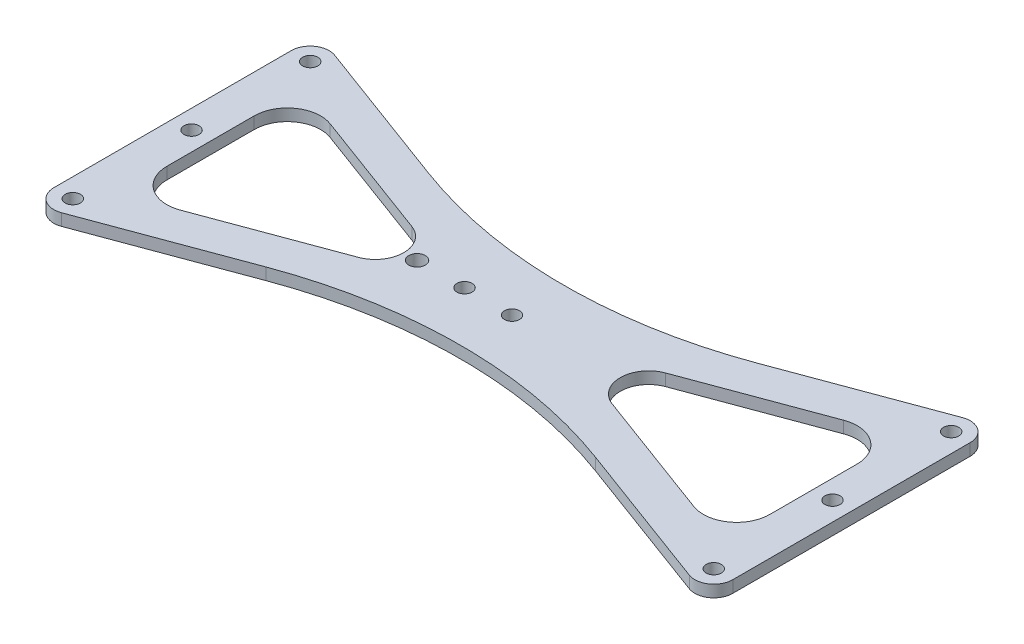
ISO-10303-21;
HEADER;
FILE_DESCRIPTION(('STEP AP214'),'2;1');
FILE_NAME('part.step','',(''),(''),'','','');
FILE_SCHEMA(('AUTOMOTIVE_DESIGN { 1 0 10303 214 1 1 1 1 }'));
ENDSEC;
DATA;
#1=APPLICATION_CONTEXT('core data for automotive mechanical design processes');
#2=APPLICATION_PROTOCOL_DEFINITION('international standard','automotive_design',2000,#1);
#3=PRODUCT_CONTEXT('',#1,'mechanical');
#4=PRODUCT('Part','Part','',(#3));
#5=PRODUCT_RELATED_PRODUCT_CATEGORY('part','',(#4));
#6=PRODUCT_DEFINITION_FORMATION('','',#4);
#7=PRODUCT_DEFINITION_CONTEXT('part definition',#1,'design');
#8=PRODUCT_DEFINITION('design','',#6,#7);
#9=PRODUCT_DEFINITION_SHAPE('','',#8);
#10=(LENGTH_UNIT() NAMED_UNIT(*) SI_UNIT(.MILLI.,.METRE.));
#11=(NAMED_UNIT(*) PLANE_ANGLE_UNIT() SI_UNIT($,.RADIAN.));
#12=(NAMED_UNIT(*) SI_UNIT($,.STERADIAN.) SOLID_ANGLE_UNIT());
#13=UNCERTAINTY_MEASURE_WITH_UNIT(LENGTH_MEASURE(1.E-05),#10,'distance_accuracy_value','');
#14=(GEOMETRIC_REPRESENTATION_CONTEXT(3) GLOBAL_UNCERTAINTY_ASSIGNED_CONTEXT((#13)) GLOBAL_UNIT_ASSIGNED_CONTEXT((#10,
#11,#12)) REPRESENTATION_CONTEXT('',''));
#15=CARTESIAN_POINT('',(0.,0.,0.));
#16=DIRECTION('',(0.,0.,1.));
#17=DIRECTION('',(1.,0.,0.));
#18=AXIS2_PLACEMENT_3D('',#15,#16,#17);
#19=CARTESIAN_POINT('',(80.6450000000001,3.175,0.));
#20=DIRECTION('',(1.,0.,0.));
#21=DIRECTION('',(0.,0.,-1.));
#22=AXIS2_PLACEMENT_3D('',#19,#20,#21);
#23=PLANE('',#22);
#24=DIRECTION('',(0.,0.,1.));
#25=VECTOR('',#24,1.);
#26=CARTESIAN_POINT('',(80.6450000000001,0.,0.));
#27=LINE('',#26,#25);
#28=CARTESIAN_POINT('',(80.6450000000001,0.,-11.6785455345952));
#29=VERTEX_POINT('',#28);
#30=CARTESIAN_POINT('',(80.6450000000001,0.,11.6785455345952));
#31=VERTEX_POINT('',#30);
#32=EDGE_CURVE('E316',#29,#31,#27,.T.);
#33=ORIENTED_EDGE('',*,*,#32,.T.);
#34=DIRECTION('',(0.,-1.,0.));
#35=VECTOR('',#34,1.);
#36=CARTESIAN_POINT('',(80.6450000000001,3.175,11.6785455345952));
#37=LINE('',#36,#35);
#38=CARTESIAN_POINT('',(80.6450000000001,3.175,11.6785455345952));
#39=VERTEX_POINT('',#38);
#40=EDGE_CURVE('E365',#31,#39,#37,.F.);
#41=ORIENTED_EDGE('',*,*,#40,.T.);
#42=DIRECTION('',(0.,0.,1.));
#43=VECTOR('',#42,1.);
#44=CARTESIAN_POINT('',(80.6450000000001,3.175,0.));
#45=LINE('',#44,#43);
#46=CARTESIAN_POINT('',(80.6450000000001,3.175,-11.6785455345952));
#47=VERTEX_POINT('',#46);
#48=EDGE_CURVE('E258',#47,#39,#45,.T.);
#49=ORIENTED_EDGE('',*,*,#48,.F.);
#50=DIRECTION('',(0.,-1.,0.));
#51=VECTOR('',#50,1.);
#52=CARTESIAN_POINT('',(80.6450000000001,3.175,-11.6785455345952));
#53=LINE('',#52,#51);
#54=EDGE_CURVE('E360',#47,#29,#53,.T.);
#55=ORIENTED_EDGE('',*,*,#54,.T.);
#56=EDGE_LOOP('',(#33,#41,#49,#55));
#57=FACE_BOUND('',#56,.T.);
#58=ADVANCED_FACE('F43',(#57),#23,.F.);
#59=CARTESIAN_POINT('',(1.76435692758385,3.175,-4.76376370447641));
#60=DIRECTION('',(0.347314355823594,0.,-0.937748760723704));
#61=DIRECTION('',(-0.937748760723704,0.,-0.347314355823594));
#62=AXIS2_PLACEMENT_3D('',#59,#60,#61);
#63=PLANE('',#62);
#64=DIRECTION('',(0.937748760723704,0.,0.347314355823594));
#65=VECTOR('',#64,1.);
#66=CARTESIAN_POINT('',(1.76435692758385,0.,-4.76376370447641));
#67=LINE('',#66,#65);
#68=CARTESIAN_POINT('',(33.9197619327997,0.,7.14564555671461));
#69=VERTEX_POINT('',#68);
#70=CARTESIAN_POINT('',(68.6673753767283,0.,20.0151320174289));
#71=VERTEX_POINT('',#70);
#72=EDGE_CURVE('E325',#69,#71,#67,.T.);
#73=ORIENTED_EDGE('',*,*,#72,.F.);
#74=DIRECTION('',(0.,-1.,0.));
#75=VECTOR('',#74,1.);
#76=CARTESIAN_POINT('',(33.9197619327996,3.175,7.14564555671461));
#77=LINE('',#76,#75);
#78=CARTESIAN_POINT('',(33.9197619327997,3.175,7.14564555671461));
#79=VERTEX_POINT('',#78);
#80=EDGE_CURVE('E399',#69,#79,#77,.F.);
#81=ORIENTED_EDGE('',*,*,#80,.T.);
#82=DIRECTION('',(0.937748760723704,0.,0.347314355823594));
#83=VECTOR('',#82,1.);
#84=CARTESIAN_POINT('',(1.76435692758385,3.175,-4.76376370447641));
#85=LINE('',#84,#83);
#86=CARTESIAN_POINT('',(68.6673753767283,3.175,20.0151320174289));
#87=VERTEX_POINT('',#86);
#88=EDGE_CURVE('E265',#79,#87,#85,.T.);
#89=ORIENTED_EDGE('',*,*,#88,.T.);
#90=DIRECTION('',(0.,-1.,0.));
#91=VECTOR('',#90,1.);
#92=CARTESIAN_POINT('',(68.6673753767283,3.175,20.0151320174289));
#93=LINE('',#92,#91);
#94=EDGE_CURVE('E227',#87,#71,#93,.T.);
#95=ORIENTED_EDGE('',*,*,#94,.T.);
#96=EDGE_LOOP('',(#73,#81,#89,#95));
#97=FACE_BOUND('',#96,.T.);
#98=ADVANCED_FACE('F473',(#97),#63,.T.);
#99=CARTESIAN_POINT('',(-1.76435692758386,3.175,4.76376370447642));
#100=DIRECTION('',(0.347314355823594,0.,-0.937748760723704));
#101=DIRECTION('',(-0.937748760723704,0.,-0.347314355823594));
#102=AXIS2_PLACEMENT_3D('',#99,#100,#101);
#103=PLANE('',#102);
#104=DIRECTION('',(0.937748760723704,0.,0.347314355823594));
#105=VECTOR('',#104,1.);
#106=CARTESIAN_POINT('',(-1.76435692758386,0.,4.76376370447642));
#107=LINE('',#106,#105);
#108=CARTESIAN_POINT('',(-68.6673753767283,0.,-20.0151320174289));
#109=VERTEX_POINT('',#108);
#110=CARTESIAN_POINT('',(-33.9197619327997,0.,-7.14564555671461));
#111=VERTEX_POINT('',#110);
#112=EDGE_CURVE('E311',#109,#111,#107,.T.);
#113=ORIENTED_EDGE('',*,*,#112,.T.);
#114=DIRECTION('',(0.,-1.,0.));
#115=VECTOR('',#114,1.);
#116=CARTESIAN_POINT('',(-33.9197619327997,3.175,-7.14564555671461));
#117=LINE('',#116,#115);
#118=CARTESIAN_POINT('',(-33.9197619327997,3.175,-7.14564555671461));
#119=VERTEX_POINT('',#118);
#120=EDGE_CURVE('E401',#111,#119,#117,.F.);
#121=ORIENTED_EDGE('',*,*,#120,.T.);
#122=DIRECTION('',(0.937748760723704,0.,0.347314355823594));
#123=VECTOR('',#122,1.);
#124=CARTESIAN_POINT('',(-1.76435692758386,3.175,4.76376370447642));
#125=LINE('',#124,#123);
#126=CARTESIAN_POINT('',(-68.6673753767283,3.175,-20.0151320174289));
#127=VERTEX_POINT('',#126);
#128=EDGE_CURVE('E255',#127,#119,#125,.T.);
#129=ORIENTED_EDGE('',*,*,#128,.F.);
#130=DIRECTION('',(0.,-1.,0.));
#131=VECTOR('',#130,1.);
#132=CARTESIAN_POINT('',(-68.6673753767283,3.175,-20.0151320174289));
#133=LINE('',#132,#131);
#134=EDGE_CURVE('E372',#127,#109,#133,.T.);
#135=ORIENTED_EDGE('',*,*,#134,.T.);
#136=EDGE_LOOP('',(#113,#121,#129,#135));
#137=FACE_BOUND('',#136,.T.);
#138=ADVANCED_FACE('F484',(#137),#103,.F.);
#139=CARTESIAN_POINT('',(-1.76435692758386,3.175,-4.76376370447642));
#140=DIRECTION('',(0.347314355823594,0.,0.937748760723703));
#141=DIRECTION('',(0.937748760723704,0.,-0.347314355823594));
#142=AXIS2_PLACEMENT_3D('',#139,#140,#141);
#143=PLANE('',#142);
#144=DIRECTION('',(-0.937748760723704,0.,0.347314355823594));
#145=VECTOR('',#144,1.);
#146=CARTESIAN_POINT('',(-1.76435692758386,3.175,-4.76376370447642));
#147=LINE('',#146,#145);
#148=CARTESIAN_POINT('',(-33.9197619327997,3.175,7.14564555671464));
#149=VERTEX_POINT('',#148);
#150=CARTESIAN_POINT('',(-68.6673753767283,3.175,20.0151320174289));
#151=VERTEX_POINT('',#150);
#152=EDGE_CURVE('E253',#149,#151,#147,.T.);
#153=ORIENTED_EDGE('',*,*,#152,.F.);
#154=DIRECTION('',(0.,-1.,0.));
#155=VECTOR('',#154,1.);
#156=CARTESIAN_POINT('',(-33.9197619327997,0.,7.14564555671464));
#157=LINE('',#156,#155);
#158=CARTESIAN_POINT('',(-33.9197619327997,0.,7.14564555671464));
#159=VERTEX_POINT('',#158);
#160=EDGE_CURVE('E400',#149,#159,#157,.T.);
#161=ORIENTED_EDGE('',*,*,#160,.T.);
#162=DIRECTION('',(-0.937748760723704,0.,0.347314355823594));
#163=VECTOR('',#162,1.);
#164=CARTESIAN_POINT('',(-1.76435692758386,0.,-4.76376370447642));
#165=LINE('',#164,#163);
#166=CARTESIAN_POINT('',(-68.6673753767283,0.,20.0151320174289));
#167=VERTEX_POINT('',#166);
#168=EDGE_CURVE('E313',#159,#167,#165,.T.);
#169=ORIENTED_EDGE('',*,*,#168,.T.);
#170=DIRECTION('',(0.,-1.,0.));
#171=VECTOR('',#170,1.);
#172=CARTESIAN_POINT('',(-68.6673753767283,3.175,20.0151320174289));
#173=LINE('',#172,#171);
#174=EDGE_CURVE('E371',#167,#151,#173,.F.);
#175=ORIENTED_EDGE('',*,*,#174,.T.);
#176=EDGE_LOOP('',(#153,#161,#169,#175));
#177=FACE_BOUND('',#176,.T.);
#178=ADVANCED_FACE('F495',(#177),#143,.F.);
#179=CARTESIAN_POINT('',(85.725,3.175,31.75));
#180=DIRECTION('',(0.,-1.,0.));
#181=DIRECTION('',(0.,0.,-1.));
#182=AXIS2_PLACEMENT_3D('',#179,#180,#181);
#183=CYLINDRICAL_SURFACE('',#182,5.08);
#184=CARTESIAN_POINT('',(85.725,0.,31.75));
#185=DIRECTION('',(0.,1.,0.));
#186=DIRECTION('',(0.,0.,1.));
#187=AXIS2_PLACEMENT_3D('',#184,#185,#186);
#188=CIRCLE('',#187,5.08);
#189=CARTESIAN_POINT('',(83.9606430724161,0.,36.5137637044764));
#190=VERTEX_POINT('',#189);
#191=CARTESIAN_POINT('',(90.805,0.,31.75));
#192=VERTEX_POINT('',#191);
#193=EDGE_CURVE('E224',#190,#192,#188,.T.);
#194=ORIENTED_EDGE('',*,*,#193,.T.);
#195=DIRECTION('',(0.,-1.,0.));
#196=VECTOR('',#195,1.);
#197=CARTESIAN_POINT('',(90.805,3.175,31.75));
#198=LINE('',#197,#196);
#199=CARTESIAN_POINT('',(90.805,3.175,31.75));
#200=VERTEX_POINT('',#199);
#201=EDGE_CURVE('E218',#200,#192,#198,.T.);
#202=ORIENTED_EDGE('',*,*,#201,.F.);
#203=CARTESIAN_POINT('',(85.725,3.175,31.75));
#204=DIRECTION('',(0.,1.,0.));
#205=DIRECTION('',(0.,0.,1.));
#206=AXIS2_PLACEMENT_3D('',#203,#204,#205);
#207=CIRCLE('',#206,5.08);
#208=CARTESIAN_POINT('',(83.9606430724161,3.175,36.5137637044764));
#209=VERTEX_POINT('',#208);
#210=EDGE_CURVE('E203',#209,#200,#207,.T.);
#211=ORIENTED_EDGE('',*,*,#210,.F.);
#212=DIRECTION('',(0.,-1.,0.));
#213=VECTOR('',#212,1.);
#214=CARTESIAN_POINT('',(83.9606430724161,3.175,36.5137637044764));
#215=LINE('',#214,#213);
#216=EDGE_CURVE('E286',#209,#190,#215,.T.);
#217=ORIENTED_EDGE('',*,*,#216,.T.);
#218=EDGE_LOOP('',(#194,#202,#211,#217));
#219=FACE_BOUND('',#218,.T.);
#220=ADVANCED_FACE('F221',(#219),#183,.T.);
#221=CARTESIAN_POINT('',(90.805,3.175,0.));
#222=DIRECTION('',(1.,0.,0.));
#223=DIRECTION('',(0.,0.,-1.));
#224=AXIS2_PLACEMENT_3D('',#221,#222,#223);
#225=PLANE('',#224);
#226=DIRECTION('',(0.,0.,1.));
#227=VECTOR('',#226,1.);
#228=CARTESIAN_POINT('',(90.805,0.,0.));
#229=LINE('',#228,#227);
#230=CARTESIAN_POINT('',(90.805,0.,-31.7500000000001));
#231=VERTEX_POINT('',#230);
#232=EDGE_CURVE('E289',#231,#192,#229,.T.);
#233=ORIENTED_EDGE('',*,*,#232,.F.);
#234=DIRECTION('',(0.,-1.,0.));
#235=VECTOR('',#234,1.);
#236=CARTESIAN_POINT('',(90.805,3.175,-31.7500000000001));
#237=LINE('',#236,#235);
#238=CARTESIAN_POINT('',(90.805,3.175,-31.7500000000001));
#239=VERTEX_POINT('',#238);
#240=EDGE_CURVE('E226',#239,#231,#237,.T.);
#241=ORIENTED_EDGE('',*,*,#240,.F.);
#242=DIRECTION('',(0.,0.,1.));
#243=VECTOR('',#242,1.);
#244=CARTESIAN_POINT('',(90.805,3.175,0.));
#245=LINE('',#244,#243);
#246=EDGE_CURVE('E208',#239,#200,#245,.T.);
#247=ORIENTED_EDGE('',*,*,#246,.T.);
#248=ORIENTED_EDGE('',*,*,#201,.T.);
#249=EDGE_LOOP('',(#233,#241,#247,#248));
#250=FACE_BOUND('',#249,.T.);
#251=ADVANCED_FACE('F229',(#250),#225,.T.);
#252=CARTESIAN_POINT('',(85.725,3.175,-31.7500000000001));
#253=DIRECTION('',(0.,-1.,0.));
#254=DIRECTION('',(0.,0.,-1.));
#255=AXIS2_PLACEMENT_3D('',#252,#253,#254);
#256=CYLINDRICAL_SURFACE('',#255,5.08);
#257=CARTESIAN_POINT('',(85.725,0.,-31.7500000000001));
#258=DIRECTION('',(0.,1.,0.));
#259=DIRECTION('',(0.,0.,1.));
#260=AXIS2_PLACEMENT_3D('',#257,#258,#259);
#261=CIRCLE('',#260,5.08);
#262=CARTESIAN_POINT('',(83.9606430724162,0.,-36.5137637044765));
#263=VERTEX_POINT('',#262);
#264=EDGE_CURVE('E293',#263,#231,#261,.F.);
#265=ORIENTED_EDGE('',*,*,#264,.F.);
#266=DIRECTION('',(0.,-1.,0.));
#267=VECTOR('',#266,1.);
#268=CARTESIAN_POINT('',(83.9606430724162,3.175,-36.5137637044765));
#269=LINE('',#268,#267);
#270=CARTESIAN_POINT('',(83.9606430724162,3.175,-36.5137637044765));
#271=VERTEX_POINT('',#270);
#272=EDGE_CURVE('E353',#271,#263,#269,.T.);
#273=ORIENTED_EDGE('',*,*,#272,.F.);
#274=CARTESIAN_POINT('',(85.725,3.175,-31.7500000000001));
#275=DIRECTION('',(0.,1.,0.));
#276=DIRECTION('',(0.,0.,1.));
#277=AXIS2_PLACEMENT_3D('',#274,#275,#276);
#278=CIRCLE('',#277,5.08);
#279=EDGE_CURVE('E233',#271,#239,#278,.F.);
#280=ORIENTED_EDGE('',*,*,#279,.T.);
#281=ORIENTED_EDGE('',*,*,#240,.T.);
#282=EDGE_LOOP('',(#265,#273,#280,#281));
#283=FACE_BOUND('',#282,.T.);
#284=ADVANCED_FACE('F463',(#283),#256,.T.);
#285=CARTESIAN_POINT('',(-1.76435692758386,3.175,-4.76376370447642));
#286=DIRECTION('',(0.347314355823594,0.,0.937748760723703));
#287=DIRECTION('',(0.937748760723704,0.,-0.347314355823594));
#288=AXIS2_PLACEMENT_3D('',#285,#286,#287);
#289=PLANE('',#288);
#290=DIRECTION('',(-0.937748760723704,0.,0.347314355823594));
#291=VECTOR('',#290,1.);
#292=CARTESIAN_POINT('',(-1.76435692758386,0.,-4.76376370447642));
#293=LINE('',#292,#291);
#294=CARTESIAN_POINT('',(44.1089231895965,0.,-21.7538674515802));
#295=VERTEX_POINT('',#294);
#296=EDGE_CURVE('E295',#263,#295,#293,.T.);
#297=ORIENTED_EDGE('',*,*,#296,.T.);
#298=DIRECTION('',(0.,-1.,0.));
#299=VECTOR('',#298,1.);
#300=CARTESIAN_POINT('',(44.1089231895964,3.175,-21.7538674515802));
#301=LINE('',#300,#299);
#302=CARTESIAN_POINT('',(44.1089231895965,3.175,-21.7538674515802));
#303=VERTEX_POINT('',#302);
#304=EDGE_CURVE('E59',#295,#303,#301,.F.);
#305=ORIENTED_EDGE('',*,*,#304,.T.);
#306=DIRECTION('',(-0.937748760723704,0.,0.347314355823594));
#307=VECTOR('',#306,1.);
#308=CARTESIAN_POINT('',(-1.76435692758386,3.175,-4.76376370447642));
#309=LINE('',#308,#307);
#310=EDGE_CURVE('E231',#271,#303,#309,.T.);
#311=ORIENTED_EDGE('',*,*,#310,.F.);
#312=ORIENTED_EDGE('',*,*,#272,.T.);
#313=EDGE_LOOP('',(#297,#305,#311,#312));
#314=FACE_BOUND('',#313,.T.);
#315=ADVANCED_FACE('F461',(#314),#289,.F.);
#316=CARTESIAN_POINT('',(1.76435692758385,3.175,-4.76376370447641));
#317=DIRECTION('',(0.347314355823594,0.,-0.937748760723704));
#318=DIRECTION('',(-0.937748760723704,0.,-0.347314355823594));
#319=AXIS2_PLACEMENT_3D('',#316,#317,#318);
#320=PLANE('',#319);
#321=DIRECTION('',(0.937748760723704,0.,0.347314355823594));
#322=VECTOR('',#321,1.);
#323=CARTESIAN_POINT('',(1.76435692758385,3.175,-4.76376370447641));
#324=LINE('',#323,#322);
#325=CARTESIAN_POINT('',(-83.9606430724161,3.175,-36.5137637044764));
#326=VERTEX_POINT('',#325);
#327=CARTESIAN_POINT('',(-44.1089231895964,3.175,-21.7538674515802));
#328=VERTEX_POINT('',#327);
#329=EDGE_CURVE('E238',#326,#328,#324,.T.);
#330=ORIENTED_EDGE('',*,*,#329,.T.);
#331=DIRECTION('',(0.,-1.,0.));
#332=VECTOR('',#331,1.);
#333=CARTESIAN_POINT('',(-44.1089231895964,3.175,-21.7538674515802));
#334=LINE('',#333,#332);
#335=CARTESIAN_POINT('',(-44.1089231895964,0.,-21.7538674515802));
#336=VERTEX_POINT('',#335);
#337=EDGE_CURVE('E419',#328,#336,#334,.T.);
#338=ORIENTED_EDGE('',*,*,#337,.T.);
#339=DIRECTION('',(0.937748760723704,0.,0.347314355823594));
#340=VECTOR('',#339,1.);
#341=CARTESIAN_POINT('',(1.76435692758385,0.,-4.76376370447641));
#342=LINE('',#341,#340);
#343=CARTESIAN_POINT('',(-83.9606430724161,0.,-36.5137637044764));
#344=VERTEX_POINT('',#343);
#345=EDGE_CURVE('E298',#344,#336,#342,.T.);
#346=ORIENTED_EDGE('',*,*,#345,.F.);
#347=DIRECTION('',(0.,-1.,0.));
#348=VECTOR('',#347,1.);
#349=CARTESIAN_POINT('',(-83.9606430724161,3.175,-36.5137637044764));
#350=LINE('',#349,#348);
#351=EDGE_CURVE('E352',#326,#344,#350,.T.);
#352=ORIENTED_EDGE('',*,*,#351,.F.);
#353=EDGE_LOOP('',(#330,#338,#346,#352));
#354=FACE_BOUND('',#353,.T.);
#355=ADVANCED_FACE('F459',(#354),#320,.T.);
#356=CARTESIAN_POINT('',(-85.725,3.175,-31.75));
#357=DIRECTION('',(0.,-1.,0.));
#358=DIRECTION('',(0.,0.,-1.));
#359=AXIS2_PLACEMENT_3D('',#356,#357,#358);
#360=CYLINDRICAL_SURFACE('',#359,5.08);
#361=CARTESIAN_POINT('',(-85.725,0.,-31.75));
#362=DIRECTION('',(0.,1.,0.));
#363=DIRECTION('',(0.,0.,1.));
#364=AXIS2_PLACEMENT_3D('',#361,#362,#363);
#365=CIRCLE('',#364,5.08);
#366=CARTESIAN_POINT('',(-90.805,0.,-31.75));
#367=VERTEX_POINT('',#366);
#368=EDGE_CURVE('E296',#367,#344,#365,.F.);
#369=ORIENTED_EDGE('',*,*,#368,.F.);
#370=DIRECTION('',(0.,-1.,0.));
#371=VECTOR('',#370,1.);
#372=CARTESIAN_POINT('',(-90.805,3.175,-31.75));
#373=LINE('',#372,#371);
#374=CARTESIAN_POINT('',(-90.805,3.175,-31.75));
#375=VERTEX_POINT('',#374);
#376=EDGE_CURVE('E348',#375,#367,#373,.T.);
#377=ORIENTED_EDGE('',*,*,#376,.F.);
#378=CARTESIAN_POINT('',(-85.725,3.175,-31.75));
#379=DIRECTION('',(0.,1.,0.));
#380=DIRECTION('',(0.,0.,1.));
#381=AXIS2_PLACEMENT_3D('',#378,#379,#380);
#382=CIRCLE('',#381,5.08);
#383=EDGE_CURVE('E241',#375,#326,#382,.F.);
#384=ORIENTED_EDGE('',*,*,#383,.T.);
#385=ORIENTED_EDGE('',*,*,#351,.T.);
#386=EDGE_LOOP('',(#369,#377,#384,#385));
#387=FACE_BOUND('',#386,.T.);
#388=ADVANCED_FACE('F452',(#387),#360,.T.);
#389=CARTESIAN_POINT('',(-90.805,3.175,0.));
#390=DIRECTION('',(1.,0.,0.));
#391=DIRECTION('',(0.,0.,-1.));
#392=AXIS2_PLACEMENT_3D('',#389,#390,#391);
#393=PLANE('',#392);
#394=DIRECTION('',(0.,0.,1.));
#395=VECTOR('',#394,1.);
#396=CARTESIAN_POINT('',(-90.805,0.,0.));
#397=LINE('',#396,#395);
#398=CARTESIAN_POINT('',(-90.805,0.,31.75));
#399=VERTEX_POINT('',#398);
#400=EDGE_CURVE('E301',#367,#399,#397,.T.);
#401=ORIENTED_EDGE('',*,*,#400,.T.);
#402=DIRECTION('',(0.,-1.,0.));
#403=VECTOR('',#402,1.);
#404=CARTESIAN_POINT('',(-90.805,3.175,31.75));
#405=LINE('',#404,#403);
#406=CARTESIAN_POINT('',(-90.805,3.175,31.75));
#407=VERTEX_POINT('',#406);
#408=EDGE_CURVE('E350',#407,#399,#405,.T.);
#409=ORIENTED_EDGE('',*,*,#408,.F.);
#410=DIRECTION('',(0.,0.,1.));
#411=VECTOR('',#410,1.);
#412=CARTESIAN_POINT('',(-90.805,3.175,0.));
#413=LINE('',#412,#411);
#414=EDGE_CURVE('E242',#375,#407,#413,.T.);
#415=ORIENTED_EDGE('',*,*,#414,.F.);
#416=ORIENTED_EDGE('',*,*,#376,.T.);
#417=EDGE_LOOP('',(#401,#409,#415,#416));
#418=FACE_BOUND('',#417,.T.);
#419=ADVANCED_FACE('F510',(#418),#393,.F.);
#420=CARTESIAN_POINT('',(-85.725,3.175,31.75));
#421=DIRECTION('',(0.,-1.,0.));
#422=DIRECTION('',(0.,0.,-1.));
#423=AXIS2_PLACEMENT_3D('',#420,#421,#422);
#424=CYLINDRICAL_SURFACE('',#423,5.08);
#425=CARTESIAN_POINT('',(-85.725,0.,31.75));
#426=DIRECTION('',(0.,1.,0.));
#427=DIRECTION('',(0.,0.,1.));
#428=AXIS2_PLACEMENT_3D('',#425,#426,#427);
#429=CIRCLE('',#428,5.08);
#430=CARTESIAN_POINT('',(-83.9606430724162,0.,36.5137637044764));
#431=VERTEX_POINT('',#430);
#432=EDGE_CURVE('E302',#431,#399,#429,.F.);
#433=ORIENTED_EDGE('',*,*,#432,.F.);
#434=DIRECTION('',(0.,-1.,0.));
#435=VECTOR('',#434,1.);
#436=CARTESIAN_POINT('',(-83.9606430724162,3.175,36.5137637044764));
#437=LINE('',#436,#435);
#438=CARTESIAN_POINT('',(-83.9606430724162,3.175,36.5137637044764));
#439=VERTEX_POINT('',#438);
#440=EDGE_CURVE('E343',#439,#431,#437,.T.);
#441=ORIENTED_EDGE('',*,*,#440,.F.);
#442=CARTESIAN_POINT('',(-85.725,3.175,31.75));
#443=DIRECTION('',(0.,1.,0.));
#444=DIRECTION('',(0.,0.,1.));
#445=AXIS2_PLACEMENT_3D('',#442,#443,#444);
#446=CIRCLE('',#445,5.08);
#447=EDGE_CURVE('E246',#439,#407,#446,.F.);
#448=ORIENTED_EDGE('',*,*,#447,.T.);
#449=ORIENTED_EDGE('',*,*,#408,.T.);
#450=EDGE_LOOP('',(#433,#441,#448,#449));
#451=FACE_BOUND('',#450,.T.);
#452=ADVANCED_FACE('F444',(#451),#424,.T.);
#453=CARTESIAN_POINT('',(1.76435692758386,3.175,4.76376370447641));
#454=DIRECTION('',(0.347314355823594,0.,0.937748760723703));
#455=DIRECTION('',(0.937748760723704,0.,-0.347314355823594));
#456=AXIS2_PLACEMENT_3D('',#453,#454,#455);
#457=PLANE('',#456);
#458=DIRECTION('',(-0.937748760723704,0.,0.347314355823594));
#459=VECTOR('',#458,1.);
#460=CARTESIAN_POINT('',(1.76435692758386,0.,4.76376370447641));
#461=LINE('',#460,#459);
#462=CARTESIAN_POINT('',(-44.1089231895965,0.,21.7538674515802));
#463=VERTEX_POINT('',#462);
#464=EDGE_CURVE('E310',#463,#431,#461,.T.);
#465=ORIENTED_EDGE('',*,*,#464,.F.);
#466=DIRECTION('',(0.,-1.,0.));
#467=VECTOR('',#466,1.);
#468=CARTESIAN_POINT('',(-44.1089231895965,3.175,21.7538674515802));
#469=LINE('',#468,#467);
#470=CARTESIAN_POINT('',(-44.1089231895965,3.175,21.7538674515802));
#471=VERTEX_POINT('',#470);
#472=EDGE_CURVE('E416',#463,#471,#469,.F.);
#473=ORIENTED_EDGE('',*,*,#472,.T.);
#474=DIRECTION('',(-0.937748760723704,0.,0.347314355823594));
#475=VECTOR('',#474,1.);
#476=CARTESIAN_POINT('',(1.76435692758386,3.175,4.76376370447641));
#477=LINE('',#476,#475);
#478=EDGE_CURVE('E248',#471,#439,#477,.T.);
#479=ORIENTED_EDGE('',*,*,#478,.T.);
#480=ORIENTED_EDGE('',*,*,#440,.T.);
#481=EDGE_LOOP('',(#465,#473,#479,#480));
#482=FACE_BOUND('',#481,.T.);
#483=ADVANCED_FACE('F441',(#482),#457,.T.);
#484=CARTESIAN_POINT('',(85.725,3.175,31.75));
#485=DIRECTION('',(0.,-1.,0.));
#486=DIRECTION('',(0.,0.,-1.));
#487=AXIS2_PLACEMENT_3D('',#484,#485,#486);
#488=CYLINDRICAL_SURFACE('',#487,2.03200000000001);
#489=CARTESIAN_POINT('',(85.725,3.175,31.75));
#490=DIRECTION('',(0.,1.,0.));
#491=DIRECTION('',(0.,0.,1.));
#492=AXIS2_PLACEMENT_3D('',#489,#490,#491);
#493=CIRCLE('',#492,2.03200000000001);
#494=CARTESIAN_POINT('',(85.725,3.175,33.782));
#495=VERTEX_POINT('',#494);
#496=EDGE_CURVE('E278',#495,#495,#493,.T.);
#497=ORIENTED_EDGE('',*,*,#496,.T.);
#498=EDGE_LOOP('',(#497));
#499=FACE_BOUND('',#498,.T.);
#500=CARTESIAN_POINT('',(85.725,0.,31.75));
#501=DIRECTION('',(0.,1.,0.));
#502=DIRECTION('',(0.,0.,1.));
#503=AXIS2_PLACEMENT_3D('',#500,#501,#502);
#504=CIRCLE('',#503,2.03200000000001);
#505=CARTESIAN_POINT('',(85.725,0.,33.782));
#506=VERTEX_POINT('',#505);
#507=EDGE_CURVE('E339',#506,#506,#504,.T.);
#508=ORIENTED_EDGE('',*,*,#507,.F.);
#509=EDGE_LOOP('',(#508));
#510=FACE_BOUND('',#509,.T.);
#511=ADVANCED_FACE('F502',(#499,#510),#488,.F.);
#512=CARTESIAN_POINT('',(85.725,3.175,-31.7500000000001));
#513=DIRECTION('',(0.,-1.,0.));
#514=DIRECTION('',(0.,0.,-1.));
#515=AXIS2_PLACEMENT_3D('',#512,#513,#514);
#516=CYLINDRICAL_SURFACE('',#515,2.03200000000001);
#517=CARTESIAN_POINT('',(85.725,3.175,-31.7500000000001));
#518=DIRECTION('',(0.,1.,0.));
#519=DIRECTION('',(0.,0.,1.));
#520=AXIS2_PLACEMENT_3D('',#517,#518,#519);
#521=CIRCLE('',#520,2.03200000000001);
#522=CARTESIAN_POINT('',(85.725,3.175,-29.7180000000001));
#523=VERTEX_POINT('',#522);
#524=EDGE_CURVE('E280',#523,#523,#521,.T.);
#525=ORIENTED_EDGE('',*,*,#524,.T.);
#526=EDGE_LOOP('',(#525));
#527=FACE_BOUND('',#526,.T.);
#528=CARTESIAN_POINT('',(85.725,0.,-31.7500000000001));
#529=DIRECTION('',(0.,1.,0.));
#530=DIRECTION('',(0.,0.,1.));
#531=AXIS2_PLACEMENT_3D('',#528,#529,#530);
#532=CIRCLE('',#531,2.03200000000001);
#533=CARTESIAN_POINT('',(85.725,0.,-29.7180000000001));
#534=VERTEX_POINT('',#533);
#535=EDGE_CURVE('E337',#534,#534,#532,.T.);
#536=ORIENTED_EDGE('',*,*,#535,.F.);
#537=EDGE_LOOP('',(#536));
#538=FACE_BOUND('',#537,.T.);
#539=ADVANCED_FACE('F705',(#527,#538),#516,.F.);
#540=CARTESIAN_POINT('',(-85.725,3.175,-31.75));
#541=DIRECTION('',(0.,-1.,0.));
#542=DIRECTION('',(0.,0.,-1.));
#543=AXIS2_PLACEMENT_3D('',#540,#541,#542);
#544=CYLINDRICAL_SURFACE('',#543,2.03200000000001);
#545=CARTESIAN_POINT('',(-85.725,3.175,-31.75));
#546=DIRECTION('',(0.,1.,0.));
#547=DIRECTION('',(0.,0.,1.));
#548=AXIS2_PLACEMENT_3D('',#545,#546,#547);
#549=CIRCLE('',#548,2.03200000000001);
#550=CARTESIAN_POINT('',(-85.725,3.175,-29.718));
#551=VERTEX_POINT('',#550);
#552=EDGE_CURVE('E274',#551,#551,#549,.T.);
#553=ORIENTED_EDGE('',*,*,#552,.T.);
#554=EDGE_LOOP('',(#553));
#555=FACE_BOUND('',#554,.T.);
#556=CARTESIAN_POINT('',(-85.725,0.,-31.75));
#557=DIRECTION('',(0.,1.,0.));
#558=DIRECTION('',(0.,0.,1.));
#559=AXIS2_PLACEMENT_3D('',#556,#557,#558);
#560=CIRCLE('',#559,2.03200000000001);
#561=CARTESIAN_POINT('',(-85.725,0.,-29.718));
#562=VERTEX_POINT('',#561);
#563=EDGE_CURVE('E334',#562,#562,#560,.T.);
#564=ORIENTED_EDGE('',*,*,#563,.F.);
#565=EDGE_LOOP('',(#564));
#566=FACE_BOUND('',#565,.T.);
#567=ADVANCED_FACE('F693',(#555,#566),#544,.F.);
#568=CARTESIAN_POINT('',(-85.725,3.175,0.));
#569=DIRECTION('',(0.,-1.,0.));
#570=DIRECTION('',(0.,0.,-1.));
#571=AXIS2_PLACEMENT_3D('',#568,#569,#570);
#572=CYLINDRICAL_SURFACE('',#571,2.03200000000001);
#573=CARTESIAN_POINT('',(-85.725,3.175,0.));
#574=DIRECTION('',(0.,1.,0.));
#575=DIRECTION('',(0.,0.,1.));
#576=AXIS2_PLACEMENT_3D('',#573,#574,#575);
#577=CIRCLE('',#576,2.03200000000001);
#578=CARTESIAN_POINT('',(-85.725,3.175,2.03200000000003));
#579=VERTEX_POINT('',#578);
#580=EDGE_CURVE('E272',#579,#579,#577,.T.);
#581=ORIENTED_EDGE('',*,*,#580,.T.);
#582=EDGE_LOOP('',(#581));
#583=FACE_BOUND('',#582,.T.);
#584=CARTESIAN_POINT('',(-85.725,0.,0.));
#585=DIRECTION('',(0.,1.,0.));
#586=DIRECTION('',(0.,0.,1.));
#587=AXIS2_PLACEMENT_3D('',#584,#585,#586);
#588=CIRCLE('',#587,2.03200000000001);
#589=CARTESIAN_POINT('',(-85.725,0.,2.03200000000003));
#590=VERTEX_POINT('',#589);
#591=EDGE_CURVE('E328',#590,#590,#588,.T.);
#592=ORIENTED_EDGE('',*,*,#591,.F.);
#593=EDGE_LOOP('',(#592));
#594=FACE_BOUND('',#593,.T.);
#595=ADVANCED_FACE('F685',(#583,#594),#572,.F.);
#596=CARTESIAN_POINT('',(-85.725,3.175,31.75));
#597=DIRECTION('',(0.,-1.,0.));
#598=DIRECTION('',(0.,0.,-1.));
#599=AXIS2_PLACEMENT_3D('',#596,#597,#598);
#600=CYLINDRICAL_SURFACE('',#599,2.03200000000001);
#601=CARTESIAN_POINT('',(-85.725,3.175,31.75));
#602=DIRECTION('',(0.,1.,0.));
#603=DIRECTION('',(0.,0.,1.));
#604=AXIS2_PLACEMENT_3D('',#601,#602,#603);
#605=CIRCLE('',#604,2.03200000000001);
#606=CARTESIAN_POINT('',(-85.725,3.175,33.782));
#607=VERTEX_POINT('',#606);
#608=EDGE_CURVE('E269',#607,#607,#605,.T.);
#609=ORIENTED_EDGE('',*,*,#608,.T.);
#610=EDGE_LOOP('',(#609));
#611=FACE_BOUND('',#610,.T.);
#612=CARTESIAN_POINT('',(-85.725,0.,31.75));
#613=DIRECTION('',(0.,1.,0.));
#614=DIRECTION('',(0.,0.,1.));
#615=AXIS2_PLACEMENT_3D('',#612,#613,#614);
#616=CIRCLE('',#615,2.03200000000001);
#617=CARTESIAN_POINT('',(-85.725,0.,33.782));
#618=VERTEX_POINT('',#617);
#619=EDGE_CURVE('E329',#618,#618,#616,.T.);
#620=ORIENTED_EDGE('',*,*,#619,.F.);
#621=EDGE_LOOP('',(#620));
#622=FACE_BOUND('',#621,.T.);
#623=ADVANCED_FACE('F676',(#611,#622),#600,.F.);
#624=CARTESIAN_POINT('',(1.76435692758386,3.175,4.76376370447641));
#625=DIRECTION('',(0.347314355823594,0.,0.937748760723703));
#626=DIRECTION('',(0.937748760723704,0.,-0.347314355823594));
#627=AXIS2_PLACEMENT_3D('',#624,#625,#626);
#628=PLANE('',#627);
#629=DIRECTION('',(-0.937748760723704,0.,0.347314355823594));
#630=VECTOR('',#629,1.);
#631=CARTESIAN_POINT('',(1.76435692758386,3.175,4.76376370447641));
#632=LINE('',#631,#630);
#633=CARTESIAN_POINT('',(68.6673753767283,3.175,-20.015132017429));
#634=VERTEX_POINT('',#633);
#635=CARTESIAN_POINT('',(33.9197619327996,3.175,-7.14564555671463));
#636=VERTEX_POINT('',#635);
#637=EDGE_CURVE('E263',#634,#636,#632,.T.);
#638=ORIENTED_EDGE('',*,*,#637,.T.);
#639=DIRECTION('',(0.,-1.,0.));
#640=VECTOR('',#639,1.);
#641=CARTESIAN_POINT('',(33.9197619327996,0.,-7.14564555671463));
#642=LINE('',#641,#640);
#643=CARTESIAN_POINT('',(33.9197619327996,0.,-7.14564555671463));
#644=VERTEX_POINT('',#643);
#645=EDGE_CURVE('E393',#636,#644,#642,.T.);
#646=ORIENTED_EDGE('',*,*,#645,.T.);
#647=DIRECTION('',(-0.937748760723704,0.,0.347314355823594));
#648=VECTOR('',#647,1.);
#649=CARTESIAN_POINT('',(1.76435692758386,0.,4.76376370447641));
#650=LINE('',#649,#648);
#651=CARTESIAN_POINT('',(68.6673753767283,0.,-20.015132017429));
#652=VERTEX_POINT('',#651);
#653=EDGE_CURVE('E321',#652,#644,#650,.T.);
#654=ORIENTED_EDGE('',*,*,#653,.F.);
#655=DIRECTION('',(0.,-1.,0.));
#656=VECTOR('',#655,1.);
#657=CARTESIAN_POINT('',(68.6673753767283,3.175,-20.015132017429));
#658=LINE('',#657,#656);
#659=EDGE_CURVE('E364',#652,#634,#658,.F.);
#660=ORIENTED_EDGE('',*,*,#659,.T.);
#661=EDGE_LOOP('',(#638,#646,#654,#660));
#662=FACE_BOUND('',#661,.T.);
#663=ADVANCED_FACE('F489',(#662),#628,.T.);
#664=CARTESIAN_POINT('',(-80.645,3.175,0.));
#665=DIRECTION('',(1.,0.,0.));
#666=DIRECTION('',(0.,0.,-1.));
#667=AXIS2_PLACEMENT_3D('',#664,#665,#666);
#668=PLANE('',#667);
#669=DIRECTION('',(0.,0.,1.));
#670=VECTOR('',#669,1.);
#671=CARTESIAN_POINT('',(-80.645,3.175,0.));
#672=LINE('',#671,#670);
#673=CARTESIAN_POINT('',(-80.645,3.175,-11.6785455345952));
#674=VERTEX_POINT('',#673);
#675=CARTESIAN_POINT('',(-80.645,3.175,11.6785455345952));
#676=VERTEX_POINT('',#675);
#677=EDGE_CURVE('E260',#674,#676,#672,.T.);
#678=ORIENTED_EDGE('',*,*,#677,.T.);
#679=DIRECTION('',(0.,-1.,0.));
#680=VECTOR('',#679,1.);
#681=CARTESIAN_POINT('',(-80.645,3.175,11.6785455345952));
#682=LINE('',#681,#680);
#683=CARTESIAN_POINT('',(-80.645,0.,11.6785455345952));
#684=VERTEX_POINT('',#683);
#685=EDGE_CURVE('E368',#676,#684,#682,.T.);
#686=ORIENTED_EDGE('',*,*,#685,.T.);
#687=DIRECTION('',(0.,0.,1.));
#688=VECTOR('',#687,1.);
#689=CARTESIAN_POINT('',(-80.645,0.,0.));
#690=LINE('',#689,#688);
#691=CARTESIAN_POINT('',(-80.645,0.,-11.6785455345952));
#692=VERTEX_POINT('',#691);
#693=EDGE_CURVE('E317',#692,#684,#690,.T.);
#694=ORIENTED_EDGE('',*,*,#693,.F.);
#695=DIRECTION('',(0.,-1.,0.));
#696=VECTOR('',#695,1.);
#697=CARTESIAN_POINT('',(-80.645,3.175,-11.6785455345952));
#698=LINE('',#697,#696);
#699=EDGE_CURVE('E366',#692,#674,#698,.F.);
#700=ORIENTED_EDGE('',*,*,#699,.T.);
#701=EDGE_LOOP('',(#678,#686,#694,#700));
#702=FACE_BOUND('',#701,.T.);
#703=ADVANCED_FACE('F486',(#702),#668,.T.);
#704=CARTESIAN_POINT('',(-1.76435692758386,3.175,4.76376370447642));
#705=DIRECTION('',(0.347314355823594,0.,-0.937748760723704));
#706=DIRECTION('',(-0.937748760723704,0.,-0.347314355823594));
#707=AXIS2_PLACEMENT_3D('',#704,#705,#706);
#708=PLANE('',#707);
#709=DIRECTION('',(0.937748760723704,0.,0.347314355823594));
#710=VECTOR('',#709,1.);
#711=CARTESIAN_POINT('',(-1.76435692758386,3.175,4.76376370447642));
#712=LINE('',#711,#710);
#713=CARTESIAN_POINT('',(44.1089231895964,3.175,21.7538674515802));
#714=VERTEX_POINT('',#713);
#715=EDGE_CURVE('E214',#714,#209,#712,.T.);
#716=ORIENTED_EDGE('',*,*,#715,.F.);
#717=DIRECTION('',(0.,-1.,0.));
#718=VECTOR('',#717,1.);
#719=CARTESIAN_POINT('',(44.1089231895964,3.175,21.7538674515802));
#720=LINE('',#719,#718);
#721=CARTESIAN_POINT('',(44.1089231895964,0.,21.7538674515802));
#722=VERTEX_POINT('',#721);
#723=EDGE_CURVE('E415',#714,#722,#720,.T.);
#724=ORIENTED_EDGE('',*,*,#723,.T.);
#725=DIRECTION('',(0.937748760723704,0.,0.347314355823594));
#726=VECTOR('',#725,1.);
#727=CARTESIAN_POINT('',(-1.76435692758386,0.,4.76376370447642));
#728=LINE('',#727,#726);
#729=EDGE_CURVE('E307',#722,#190,#728,.T.);
#730=ORIENTED_EDGE('',*,*,#729,.T.);
#731=ORIENTED_EDGE('',*,*,#216,.F.);
#732=EDGE_LOOP('',(#716,#724,#730,#731));
#733=FACE_BOUND('',#732,.T.);
#734=ADVANCED_FACE('F432',(#733),#708,.F.);
#735=CARTESIAN_POINT('',(85.725,3.175,0.));
#736=DIRECTION('',(0.,-1.,0.));
#737=DIRECTION('',(0.,0.,-1.));
#738=AXIS2_PLACEMENT_3D('',#735,#736,#737);
#739=CYLINDRICAL_SURFACE('',#738,2.03200000000001);
#740=CARTESIAN_POINT('',(85.725,3.175,0.));
#741=DIRECTION('',(0.,1.,0.));
#742=DIRECTION('',(0.,0.,1.));
#743=AXIS2_PLACEMENT_3D('',#740,#741,#742);
#744=CIRCLE('',#743,2.03200000000001);
#745=CARTESIAN_POINT('',(85.725,3.175,2.03199999999995));
#746=VERTEX_POINT('',#745);
#747=EDGE_CURVE('E285',#746,#746,#744,.T.);
#748=ORIENTED_EDGE('',*,*,#747,.T.);
#749=EDGE_LOOP('',(#748));
#750=FACE_BOUND('',#749,.T.);
#751=CARTESIAN_POINT('',(85.725,0.,0.));
#752=DIRECTION('',(0.,1.,0.));
#753=DIRECTION('',(0.,0.,1.));
#754=AXIS2_PLACEMENT_3D('',#751,#752,#753);
#755=CIRCLE('',#754,2.03200000000001);
#756=CARTESIAN_POINT('',(85.725,0.,2.03199999999995));
#757=VERTEX_POINT('',#756);
#758=EDGE_CURVE('E219',#757,#757,#755,.T.);
#759=ORIENTED_EDGE('',*,*,#758,.F.);
#760=EDGE_LOOP('',(#759));
#761=FACE_BOUND('',#760,.T.);
#762=ADVANCED_FACE('F501',(#750,#761),#739,.F.);
#763=CARTESIAN_POINT('',(0.,3.175,0.));
#764=DIRECTION('',(0.,1.,0.));
#765=DIRECTION('',(0.,0.,1.));
#766=AXIS2_PLACEMENT_3D('',#763,#764,#765);
#767=PLANE('',#766);
#768=CARTESIAN_POINT('',(-25.4,3.175,0.));
#769=DIRECTION('',(0.,1.,0.));
#770=DIRECTION('',(0.,0.,1.));
#771=AXIS2_PLACEMENT_3D('',#768,#769,#770);
#772=CIRCLE('',#771,2.2225);
#773=CARTESIAN_POINT('',(-25.4,3.175,2.2225));
#774=VERTEX_POINT('',#773);
#775=EDGE_CURVE('E288',#774,#774,#772,.T.);
#776=ORIENTED_EDGE('',*,*,#775,.F.);
#777=EDGE_LOOP('',(#776));
#778=FACE_BOUND('',#777,.T.);
#779=CARTESIAN_POINT('',(-12.7,3.175,0.));
#780=DIRECTION('',(0.,1.,0.));
#781=DIRECTION('',(0.,0.,1.));
#782=AXIS2_PLACEMENT_3D('',#779,#780,#781);
#783=CIRCLE('',#782,2.032);
#784=CARTESIAN_POINT('',(-12.7,3.175,2.032));
#785=VERTEX_POINT('',#784);
#786=EDGE_CURVE('E939',#785,#785,#783,.T.);
#787=ORIENTED_EDGE('',*,*,#786,.F.);
#788=EDGE_LOOP('',(#787));
#789=FACE_BOUND('',#788,.T.);
#790=CARTESIAN_POINT('',(0.,3.175,0.));
#791=DIRECTION('',(0.,1.,0.));
#792=DIRECTION('',(0.,0.,1.));
#793=AXIS2_PLACEMENT_3D('',#790,#791,#792);
#794=CIRCLE('',#793,2.032);
#795=CARTESIAN_POINT('',(0.,3.175,2.03199999999996));
#796=VERTEX_POINT('',#795);
#797=EDGE_CURVE('E944',#796,#796,#794,.T.);
#798=ORIENTED_EDGE('',*,*,#797,.F.);
#799=EDGE_LOOP('',(#798));
#800=FACE_BOUND('',#799,.T.);
#801=ORIENTED_EDGE('',*,*,#210,.T.);
#802=ORIENTED_EDGE('',*,*,#246,.F.);
#803=ORIENTED_EDGE('',*,*,#279,.F.);
#804=ORIENTED_EDGE('',*,*,#310,.T.);
#805=CARTESIAN_POINT('',(0.,3.175,-140.847960063491));
#806=DIRECTION('',(0.,1.,0.));
#807=DIRECTION('',(0.,0.,1.));
#808=AXIS2_PLACEMENT_3D('',#805,#806,#807);
#809=CIRCLE('',#808,127.);
#810=EDGE_CURVE('E11',#303,#328,#809,.F.);
#811=ORIENTED_EDGE('',*,*,#810,.T.);
#812=ORIENTED_EDGE('',*,*,#329,.F.);
#813=ORIENTED_EDGE('',*,*,#383,.F.);
#814=ORIENTED_EDGE('',*,*,#414,.T.);
#815=ORIENTED_EDGE('',*,*,#447,.F.);
#816=ORIENTED_EDGE('',*,*,#478,.F.);
#817=CARTESIAN_POINT('',(0.,3.175,140.847960063491));
#818=DIRECTION('',(0.,1.,0.));
#819=DIRECTION('',(0.,0.,1.));
#820=AXIS2_PLACEMENT_3D('',#817,#818,#819);
#821=CIRCLE('',#820,127.);
#822=EDGE_CURVE('E424',#471,#714,#821,.F.);
#823=ORIENTED_EDGE('',*,*,#822,.T.);
#824=ORIENTED_EDGE('',*,*,#715,.T.);
#825=EDGE_LOOP('',(#801,#802,#803,#804,#811,#812,#813,#814,#815,#816,#823,#824));
#826=FACE_BOUND('',#825,.T.);
#827=ORIENTED_EDGE('',*,*,#677,.F.);
#828=CARTESIAN_POINT('',(-71.755,3.175,-11.6785455345952));
#829=DIRECTION('',(0.,1.,0.));
#830=DIRECTION('',(0.,0.,1.));
#831=AXIS2_PLACEMENT_3D('',#828,#829,#830);
#832=CIRCLE('',#831,8.89);
#833=EDGE_CURVE('E395',#674,#127,#832,.F.);
#834=ORIENTED_EDGE('',*,*,#833,.T.);
#835=ORIENTED_EDGE('',*,*,#128,.T.);
#836=CARTESIAN_POINT('',(-36.5662973241755,3.175,0.));
#837=DIRECTION('',(0.,1.,0.));
#838=DIRECTION('',(0.,0.,1.));
#839=AXIS2_PLACEMENT_3D('',#836,#837,#838);
#840=CIRCLE('',#839,7.62);
#841=EDGE_CURVE('E412',#119,#149,#840,.F.);
#842=ORIENTED_EDGE('',*,*,#841,.T.);
#843=ORIENTED_EDGE('',*,*,#152,.T.);
#844=CARTESIAN_POINT('',(-71.755,3.175,11.6785455345952));
#845=DIRECTION('',(0.,1.,0.));
#846=DIRECTION('',(0.,0.,1.));
#847=AXIS2_PLACEMENT_3D('',#844,#845,#846);
#848=CIRCLE('',#847,8.89);
#849=EDGE_CURVE('E386',#151,#676,#848,.F.);
#850=ORIENTED_EDGE('',*,*,#849,.T.);
#851=EDGE_LOOP('',(#827,#834,#835,#842,#843,#850));
#852=FACE_BOUND('',#851,.T.);
#853=ORIENTED_EDGE('',*,*,#637,.F.);
#854=CARTESIAN_POINT('',(71.7550000000001,3.175,-11.6785455345952));
#855=DIRECTION('',(0.,1.,0.));
#856=DIRECTION('',(0.,0.,1.));
#857=AXIS2_PLACEMENT_3D('',#854,#855,#856);
#858=CIRCLE('',#857,8.89);
#859=EDGE_CURVE('E381',#634,#47,#858,.F.);
#860=ORIENTED_EDGE('',*,*,#859,.T.);
#861=ORIENTED_EDGE('',*,*,#48,.T.);
#862=CARTESIAN_POINT('',(71.7550000000001,3.175,11.6785455345952));
#863=DIRECTION('',(0.,1.,0.));
#864=DIRECTION('',(0.,0.,1.));
#865=AXIS2_PLACEMENT_3D('',#862,#863,#864);
#866=CIRCLE('',#865,8.89);
#867=EDGE_CURVE('E378',#39,#87,#866,.F.);
#868=ORIENTED_EDGE('',*,*,#867,.T.);
#869=ORIENTED_EDGE('',*,*,#88,.F.);
#870=CARTESIAN_POINT('',(36.5662973241754,3.175,0.));
#871=DIRECTION('',(0.,1.,0.));
#872=DIRECTION('',(0.,0.,1.));
#873=AXIS2_PLACEMENT_3D('',#870,#871,#872);
#874=CIRCLE('',#873,7.62);
#875=EDGE_CURVE('E410',#79,#636,#874,.F.);
#876=ORIENTED_EDGE('',*,*,#875,.T.);
#877=EDGE_LOOP('',(#853,#860,#861,#868,#869,#876));
#878=FACE_BOUND('',#877,.T.);
#879=ORIENTED_EDGE('',*,*,#608,.F.);
#880=EDGE_LOOP('',(#879));
#881=FACE_BOUND('',#880,.T.);
#882=ORIENTED_EDGE('',*,*,#580,.F.);
#883=EDGE_LOOP('',(#882));
#884=FACE_BOUND('',#883,.T.);
#885=ORIENTED_EDGE('',*,*,#552,.F.);
#886=EDGE_LOOP('',(#885));
#887=FACE_BOUND('',#886,.T.);
#888=ORIENTED_EDGE('',*,*,#524,.F.);
#889=EDGE_LOOP('',(#888));
#890=FACE_BOUND('',#889,.T.);
#891=ORIENTED_EDGE('',*,*,#496,.F.);
#892=EDGE_LOOP('',(#891));
#893=FACE_BOUND('',#892,.T.);
#894=ORIENTED_EDGE('',*,*,#747,.F.);
#895=EDGE_LOOP('',(#894));
#896=FACE_BOUND('',#895,.T.);
#897=ADVANCED_FACE('F207',(#778,#789,#800,#826,#852,#878,#881,#884,#887,#890,#893,#896),#767,.T.);
#898=CARTESIAN_POINT('',(0.,0.,0.));
#899=DIRECTION('',(0.,1.,0.));
#900=DIRECTION('',(0.,0.,1.));
#901=AXIS2_PLACEMENT_3D('',#898,#899,#900);
#902=PLANE('',#901);
#903=CARTESIAN_POINT('',(-25.4,0.,0.));
#904=DIRECTION('',(0.,1.,0.));
#905=DIRECTION('',(0.,0.,1.));
#906=AXIS2_PLACEMENT_3D('',#903,#904,#905);
#907=CIRCLE('',#906,2.2225);
#908=CARTESIAN_POINT('',(-25.4,0.,2.2225));
#909=VERTEX_POINT('',#908);
#910=EDGE_CURVE('E935',#909,#909,#907,.T.);
#911=ORIENTED_EDGE('',*,*,#910,.T.);
#912=EDGE_LOOP('',(#911));
#913=FACE_BOUND('',#912,.T.);
#914=CARTESIAN_POINT('',(-12.7,0.,0.));
#915=DIRECTION('',(0.,1.,0.));
#916=DIRECTION('',(0.,0.,1.));
#917=AXIS2_PLACEMENT_3D('',#914,#915,#916);
#918=CIRCLE('',#917,2.032);
#919=CARTESIAN_POINT('',(-12.7,0.,2.032));
#920=VERTEX_POINT('',#919);
#921=EDGE_CURVE('E931',#920,#920,#918,.T.);
#922=ORIENTED_EDGE('',*,*,#921,.T.);
#923=EDGE_LOOP('',(#922));
#924=FACE_BOUND('',#923,.T.);
#925=CARTESIAN_POINT('',(0.,0.,0.));
#926=DIRECTION('',(0.,1.,0.));
#927=DIRECTION('',(0.,0.,1.));
#928=AXIS2_PLACEMENT_3D('',#925,#926,#927);
#929=CIRCLE('',#928,2.032);
#930=CARTESIAN_POINT('',(0.,0.,2.03199999999996));
#931=VERTEX_POINT('',#930);
#932=EDGE_CURVE('E941',#931,#931,#929,.T.);
#933=ORIENTED_EDGE('',*,*,#932,.T.);
#934=EDGE_LOOP('',(#933));
#935=FACE_BOUND('',#934,.T.);
#936=ORIENTED_EDGE('',*,*,#193,.F.);
#937=ORIENTED_EDGE('',*,*,#729,.F.);
#938=CARTESIAN_POINT('',(0.,0.,140.847960063491));
#939=DIRECTION('',(0.,1.,0.));
#940=DIRECTION('',(0.,0.,1.));
#941=AXIS2_PLACEMENT_3D('',#938,#939,#940);
#942=CIRCLE('',#941,127.);
#943=EDGE_CURVE('E422',#722,#463,#942,.T.);
#944=ORIENTED_EDGE('',*,*,#943,.T.);
#945=ORIENTED_EDGE('',*,*,#464,.T.);
#946=ORIENTED_EDGE('',*,*,#432,.T.);
#947=ORIENTED_EDGE('',*,*,#400,.F.);
#948=ORIENTED_EDGE('',*,*,#368,.T.);
#949=ORIENTED_EDGE('',*,*,#345,.T.);
#950=CARTESIAN_POINT('',(0.,0.,-140.847960063491));
#951=DIRECTION('',(0.,1.,0.));
#952=DIRECTION('',(0.,0.,1.));
#953=AXIS2_PLACEMENT_3D('',#950,#951,#952);
#954=CIRCLE('',#953,127.);
#955=EDGE_CURVE('E51',#336,#295,#954,.T.);
#956=ORIENTED_EDGE('',*,*,#955,.T.);
#957=ORIENTED_EDGE('',*,*,#296,.F.);
#958=ORIENTED_EDGE('',*,*,#264,.T.);
#959=ORIENTED_EDGE('',*,*,#232,.T.);
#960=EDGE_LOOP('',(#936,#937,#944,#945,#946,#947,#948,#949,#956,#957,#958,#959));
#961=FACE_BOUND('',#960,.T.);
#962=ORIENTED_EDGE('',*,*,#112,.F.);
#963=CARTESIAN_POINT('',(-71.755,0.,-11.6785455345952));
#964=DIRECTION('',(0.,1.,0.));
#965=DIRECTION('',(0.,0.,1.));
#966=AXIS2_PLACEMENT_3D('',#963,#964,#965);
#967=CIRCLE('',#966,8.89);
#968=EDGE_CURVE('E392',#109,#692,#967,.T.);
#969=ORIENTED_EDGE('',*,*,#968,.T.);
#970=ORIENTED_EDGE('',*,*,#693,.T.);
#971=CARTESIAN_POINT('',(-71.755,0.,11.6785455345952));
#972=DIRECTION('',(0.,1.,0.));
#973=DIRECTION('',(0.,0.,1.));
#974=AXIS2_PLACEMENT_3D('',#971,#972,#973);
#975=CIRCLE('',#974,8.89);
#976=EDGE_CURVE('E387',#684,#167,#975,.T.);
#977=ORIENTED_EDGE('',*,*,#976,.T.);
#978=ORIENTED_EDGE('',*,*,#168,.F.);
#979=CARTESIAN_POINT('',(-36.5662973241755,0.,0.));
#980=DIRECTION('',(0.,1.,0.));
#981=DIRECTION('',(0.,0.,1.));
#982=AXIS2_PLACEMENT_3D('',#979,#980,#981);
#983=CIRCLE('',#982,7.62);
#984=EDGE_CURVE('E406',#159,#111,#983,.T.);
#985=ORIENTED_EDGE('',*,*,#984,.T.);
#986=EDGE_LOOP('',(#962,#969,#970,#977,#978,#985));
#987=FACE_BOUND('',#986,.T.);
#988=ORIENTED_EDGE('',*,*,#32,.F.);
#989=CARTESIAN_POINT('',(71.7550000000001,0.,-11.6785455345952));
#990=DIRECTION('',(0.,1.,0.));
#991=DIRECTION('',(0.,0.,1.));
#992=AXIS2_PLACEMENT_3D('',#989,#990,#991);
#993=CIRCLE('',#992,8.89);
#994=EDGE_CURVE('E385',#29,#652,#993,.T.);
#995=ORIENTED_EDGE('',*,*,#994,.T.);
#996=ORIENTED_EDGE('',*,*,#653,.T.);
#997=CARTESIAN_POINT('',(36.5662973241754,0.,0.));
#998=DIRECTION('',(0.,1.,0.));
#999=DIRECTION('',(0.,0.,1.));
#1000=AXIS2_PLACEMENT_3D('',#997,#998,#999);
#1001=CIRCLE('',#1000,7.62);
#1002=EDGE_CURVE('E403',#644,#69,#1001,.T.);
#1003=ORIENTED_EDGE('',*,*,#1002,.T.);
#1004=ORIENTED_EDGE('',*,*,#72,.T.);
#1005=CARTESIAN_POINT('',(71.7550000000001,0.,11.6785455345952));
#1006=DIRECTION('',(0.,1.,0.));
#1007=DIRECTION('',(0.,0.,1.));
#1008=AXIS2_PLACEMENT_3D('',#1005,#1006,#1007);
#1009=CIRCLE('',#1008,8.89);
#1010=EDGE_CURVE('E380',#71,#31,#1009,.T.);
#1011=ORIENTED_EDGE('',*,*,#1010,.T.);
#1012=EDGE_LOOP('',(#988,#995,#996,#1003,#1004,#1011));
#1013=FACE_BOUND('',#1012,.T.);
#1014=ORIENTED_EDGE('',*,*,#619,.T.);
#1015=EDGE_LOOP('',(#1014));
#1016=FACE_BOUND('',#1015,.T.);
#1017=ORIENTED_EDGE('',*,*,#591,.T.);
#1018=EDGE_LOOP('',(#1017));
#1019=FACE_BOUND('',#1018,.T.);
#1020=ORIENTED_EDGE('',*,*,#563,.T.);
#1021=EDGE_LOOP('',(#1020));
#1022=FACE_BOUND('',#1021,.T.);
#1023=ORIENTED_EDGE('',*,*,#535,.T.);
#1024=EDGE_LOOP('',(#1023));
#1025=FACE_BOUND('',#1024,.T.);
#1026=ORIENTED_EDGE('',*,*,#507,.T.);
#1027=EDGE_LOOP('',(#1026));
#1028=FACE_BOUND('',#1027,.T.);
#1029=ORIENTED_EDGE('',*,*,#758,.T.);
#1030=EDGE_LOOP('',(#1029));
#1031=FACE_BOUND('',#1030,.T.);
#1032=ADVANCED_FACE('F438',(#913,#924,#935,#961,#987,#1013,#1016,#1019,#1022,#1025,#1028,#1031),
#902,.F.);
#1033=CARTESIAN_POINT('',(71.7550000000001,3.175,11.6785455345952));
#1034=DIRECTION('',(0.,-1.,0.));
#1035=DIRECTION('',(0.,0.,-1.));
#1036=AXIS2_PLACEMENT_3D('',#1033,#1034,#1035);
#1037=CYLINDRICAL_SURFACE('',#1036,8.89);
#1038=ORIENTED_EDGE('',*,*,#867,.F.);
#1039=ORIENTED_EDGE('',*,*,#40,.F.);
#1040=ORIENTED_EDGE('',*,*,#1010,.F.);
#1041=ORIENTED_EDGE('',*,*,#94,.F.);
#1042=EDGE_LOOP('',(#1038,#1039,#1040,#1041));
#1043=FACE_BOUND('',#1042,.T.);
#1044=ADVANCED_FACE('F562',(#1043),#1037,.F.);
#1045=CARTESIAN_POINT('',(71.7550000000001,3.175,-11.6785455345952));
#1046=DIRECTION('',(0.,-1.,0.));
#1047=DIRECTION('',(0.,0.,-1.));
#1048=AXIS2_PLACEMENT_3D('',#1045,#1046,#1047);
#1049=CYLINDRICAL_SURFACE('',#1048,8.89);
#1050=ORIENTED_EDGE('',*,*,#859,.F.);
#1051=ORIENTED_EDGE('',*,*,#659,.F.);
#1052=ORIENTED_EDGE('',*,*,#994,.F.);
#1053=ORIENTED_EDGE('',*,*,#54,.F.);
#1054=EDGE_LOOP('',(#1050,#1051,#1052,#1053));
#1055=FACE_BOUND('',#1054,.T.);
#1056=ADVANCED_FACE('F629',(#1055),#1049,.F.);
#1057=CARTESIAN_POINT('',(-71.755,3.175,11.6785455345952));
#1058=DIRECTION('',(0.,-1.,0.));
#1059=DIRECTION('',(0.,0.,-1.));
#1060=AXIS2_PLACEMENT_3D('',#1057,#1058,#1059);
#1061=CYLINDRICAL_SURFACE('',#1060,8.89);
#1062=ORIENTED_EDGE('',*,*,#849,.F.);
#1063=ORIENTED_EDGE('',*,*,#174,.F.);
#1064=ORIENTED_EDGE('',*,*,#976,.F.);
#1065=ORIENTED_EDGE('',*,*,#685,.F.);
#1066=EDGE_LOOP('',(#1062,#1063,#1064,#1065));
#1067=FACE_BOUND('',#1066,.T.);
#1068=ADVANCED_FACE('F623',(#1067),#1061,.F.);
#1069=CARTESIAN_POINT('',(-71.755,3.175,-11.6785455345952));
#1070=DIRECTION('',(0.,-1.,0.));
#1071=DIRECTION('',(0.,0.,-1.));
#1072=AXIS2_PLACEMENT_3D('',#1069,#1070,#1071);
#1073=CYLINDRICAL_SURFACE('',#1072,8.89);
#1074=ORIENTED_EDGE('',*,*,#833,.F.);
#1075=ORIENTED_EDGE('',*,*,#699,.F.);
#1076=ORIENTED_EDGE('',*,*,#968,.F.);
#1077=ORIENTED_EDGE('',*,*,#134,.F.);
#1078=EDGE_LOOP('',(#1074,#1075,#1076,#1077));
#1079=FACE_BOUND('',#1078,.T.);
#1080=ADVANCED_FACE('F612',(#1079),#1073,.F.);
#1081=CARTESIAN_POINT('',(36.5662973241754,3.175,0.));
#1082=DIRECTION('',(0.,1.,0.));
#1083=DIRECTION('',(0.,0.,1.));
#1084=AXIS2_PLACEMENT_3D('',#1081,#1082,#1083);
#1085=CYLINDRICAL_SURFACE('',#1084,7.62);
#1086=ORIENTED_EDGE('',*,*,#875,.F.);
#1087=ORIENTED_EDGE('',*,*,#80,.F.);
#1088=ORIENTED_EDGE('',*,*,#1002,.F.);
#1089=ORIENTED_EDGE('',*,*,#645,.F.);
#1090=EDGE_LOOP('',(#1086,#1087,#1088,#1089));
#1091=FACE_BOUND('',#1090,.T.);
#1092=ADVANCED_FACE('F604',(#1091),#1085,.F.);
#1093=CARTESIAN_POINT('',(-36.5662973241755,3.175,0.));
#1094=DIRECTION('',(0.,1.,0.));
#1095=DIRECTION('',(0.,0.,1.));
#1096=AXIS2_PLACEMENT_3D('',#1093,#1094,#1095);
#1097=CYLINDRICAL_SURFACE('',#1096,7.62);
#1098=ORIENTED_EDGE('',*,*,#841,.F.);
#1099=ORIENTED_EDGE('',*,*,#120,.F.);
#1100=ORIENTED_EDGE('',*,*,#984,.F.);
#1101=ORIENTED_EDGE('',*,*,#160,.F.);
#1102=EDGE_LOOP('',(#1098,#1099,#1100,#1101));
#1103=FACE_BOUND('',#1102,.T.);
#1104=ADVANCED_FACE('F536',(#1103),#1097,.F.);
#1105=CARTESIAN_POINT('',(0.,3.175,140.847960063491));
#1106=DIRECTION('',(0.,-1.,0.));
#1107=DIRECTION('',(0.,0.,-1.));
#1108=AXIS2_PLACEMENT_3D('',#1105,#1106,#1107);
#1109=CYLINDRICAL_SURFACE('',#1108,127.);
#1110=ORIENTED_EDGE('',*,*,#822,.F.);
#1111=ORIENTED_EDGE('',*,*,#472,.F.);
#1112=ORIENTED_EDGE('',*,*,#943,.F.);
#1113=ORIENTED_EDGE('',*,*,#723,.F.);
#1114=EDGE_LOOP('',(#1110,#1111,#1112,#1113));
#1115=FACE_BOUND('',#1114,.T.);
#1116=ADVANCED_FACE('F436',(#1115),#1109,.F.);
#1117=CARTESIAN_POINT('',(0.,3.175,-140.847960063491));
#1118=DIRECTION('',(0.,-1.,0.));
#1119=DIRECTION('',(0.,0.,-1.));
#1120=AXIS2_PLACEMENT_3D('',#1117,#1118,#1119);
#1121=CYLINDRICAL_SURFACE('',#1120,127.);
#1122=ORIENTED_EDGE('',*,*,#810,.F.);
#1123=ORIENTED_EDGE('',*,*,#304,.F.);
#1124=ORIENTED_EDGE('',*,*,#955,.F.);
#1125=ORIENTED_EDGE('',*,*,#337,.F.);
#1126=EDGE_LOOP('',(#1122,#1123,#1124,#1125));
#1127=FACE_BOUND('',#1126,.T.);
#1128=ADVANCED_FACE('F44',(#1127),#1121,.F.);
#1129=CARTESIAN_POINT('',(0.,3.175,0.));
#1130=DIRECTION('',(0.,-1.,0.));
#1131=DIRECTION('',(0.,0.,-1.));
#1132=AXIS2_PLACEMENT_3D('',#1129,#1130,#1131);
#1133=CYLINDRICAL_SURFACE('',#1132,2.032);
#1134=ORIENTED_EDGE('',*,*,#797,.T.);
#1135=EDGE_LOOP('',(#1134));
#1136=FACE_BOUND('',#1135,.T.);
#1137=ORIENTED_EDGE('',*,*,#932,.F.);
#1138=EDGE_LOOP('',(#1137));
#1139=FACE_BOUND('',#1138,.T.);
#1140=ADVANCED_FACE('F547',(#1136,#1139),#1133,.F.);
#1141=CARTESIAN_POINT('',(-12.7,3.175,0.));
#1142=DIRECTION('',(0.,-1.,0.));
#1143=DIRECTION('',(0.,0.,-1.));
#1144=AXIS2_PLACEMENT_3D('',#1141,#1142,#1143);
#1145=CYLINDRICAL_SURFACE('',#1144,2.032);
#1146=ORIENTED_EDGE('',*,*,#786,.T.);
#1147=EDGE_LOOP('',(#1146));
#1148=FACE_BOUND('',#1147,.T.);
#1149=ORIENTED_EDGE('',*,*,#921,.F.);
#1150=EDGE_LOOP('',(#1149));
#1151=FACE_BOUND('',#1150,.T.);
#1152=ADVANCED_FACE('F572',(#1148,#1151),#1145,.F.);
#1153=CARTESIAN_POINT('',(-25.4,3.175,0.));
#1154=DIRECTION('',(0.,-1.,0.));
#1155=DIRECTION('',(0.,0.,-1.));
#1156=AXIS2_PLACEMENT_3D('',#1153,#1154,#1155);
#1157=CYLINDRICAL_SURFACE('',#1156,2.2225);
#1158=ORIENTED_EDGE('',*,*,#775,.T.);
#1159=EDGE_LOOP('',(#1158));
#1160=FACE_BOUND('',#1159,.T.);
#1161=ORIENTED_EDGE('',*,*,#910,.F.);
#1162=EDGE_LOOP('',(#1161));
#1163=FACE_BOUND('',#1162,.T.);
#1164=ADVANCED_FACE('F585',(#1160,#1163),#1157,.F.);
#1165=CLOSED_SHELL('',(#58,#98,#138,#178,#220,#251,#284,#315,#355,#388,#419,#452,#483,#511,#539,
#567,#595,#623,#663,#703,#734,#762,#897,#1032,#1044,#1056,#1068,#1080,#1092,#1104,#1116,#1128,
#1140,#1152,#1164));
#1166=MANIFOLD_SOLID_BREP('B2',#1165);
#1167=ADVANCED_BREP_SHAPE_REPRESENTATION('',(#18,#1166),#14);
#1168=SHAPE_DEFINITION_REPRESENTATION(#9,#1167);
ENDSEC;
END-ISO-10303-21;
